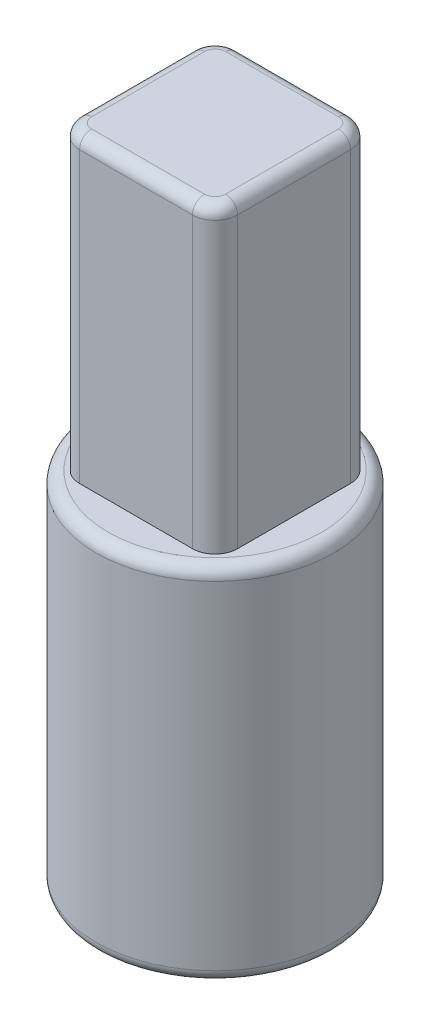
ISO-10303-21;
HEADER;
FILE_DESCRIPTION(('STEP AP214'),'2;1');
FILE_NAME('part.step','',(''),(''),'','','');
FILE_SCHEMA(('AUTOMOTIVE_DESIGN { 1 0 10303 214 1 1 1 1 }'));
ENDSEC;
DATA;
#1=APPLICATION_CONTEXT('core data for automotive mechanical design processes');
#2=APPLICATION_PROTOCOL_DEFINITION('international standard','automotive_design',2000,#1);
#3=PRODUCT_CONTEXT('',#1,'mechanical');
#4=PRODUCT('Part','Part','',(#3));
#5=PRODUCT_RELATED_PRODUCT_CATEGORY('part','',(#4));
#6=PRODUCT_DEFINITION_FORMATION('','',#4);
#7=PRODUCT_DEFINITION_CONTEXT('part definition',#1,'design');
#8=PRODUCT_DEFINITION('design','',#6,#7);
#9=PRODUCT_DEFINITION_SHAPE('','',#8);
#10=(LENGTH_UNIT() NAMED_UNIT(*) SI_UNIT(.MILLI.,.METRE.));
#11=(NAMED_UNIT(*) PLANE_ANGLE_UNIT() SI_UNIT($,.RADIAN.));
#12=(NAMED_UNIT(*) SI_UNIT($,.STERADIAN.) SOLID_ANGLE_UNIT());
#13=UNCERTAINTY_MEASURE_WITH_UNIT(LENGTH_MEASURE(1.E-05),#10,'distance_accuracy_value','');
#14=(GEOMETRIC_REPRESENTATION_CONTEXT(3) GLOBAL_UNCERTAINTY_ASSIGNED_CONTEXT((#13)) GLOBAL_UNIT_ASSIGNED_CONTEXT((#10,
#11,#12)) REPRESENTATION_CONTEXT('',''));
#15=CARTESIAN_POINT('',(0.,0.,0.));
#16=DIRECTION('',(0.,0.,1.));
#17=DIRECTION('',(1.,0.,0.));
#18=AXIS2_PLACEMENT_3D('',#15,#16,#17);
#19=CARTESIAN_POINT('',(0.,12.,0.));
#20=DIRECTION('',(0.,-1.,0.));
#21=DIRECTION('',(0.,0.,-1.));
#22=AXIS2_PLACEMENT_3D('',#19,#20,#21);
#23=CYLINDRICAL_SURFACE('',#22,3.95);
#24=CARTESIAN_POINT('',(0.,11.6,0.));
#25=DIRECTION('',(0.,1.,0.));
#26=DIRECTION('',(0.,0.,1.));
#27=AXIS2_PLACEMENT_3D('',#24,#25,#26);
#28=CIRCLE('',#27,3.95);
#29=CARTESIAN_POINT('',(0.,11.6,3.95));
#30=VERTEX_POINT('',#29);
#31=EDGE_CURVE('E247',#30,#30,#28,.F.);
#32=ORIENTED_EDGE('',*,*,#31,.T.);
#33=EDGE_LOOP('',(#32));
#34=FACE_BOUND('',#33,.T.);
#35=CARTESIAN_POINT('',(0.,0.399999999999999,0.));
#36=DIRECTION('',(0.,1.,0.));
#37=DIRECTION('',(0.,0.,1.));
#38=AXIS2_PLACEMENT_3D('',#35,#36,#37);
#39=CIRCLE('',#38,3.95);
#40=CARTESIAN_POINT('',(0.,0.399999999999999,3.95));
#41=VERTEX_POINT('',#40);
#42=EDGE_CURVE('E244',#41,#41,#39,.T.);
#43=ORIENTED_EDGE('',*,*,#42,.T.);
#44=EDGE_LOOP('',(#43));
#45=FACE_BOUND('',#44,.T.);
#46=ADVANCED_FACE('F35',(#34,#45),#23,.T.);
#47=CARTESIAN_POINT('',(0.,12.,0.));
#48=DIRECTION('',(0.,1.,0.));
#49=DIRECTION('',(0.,0.,1.));
#50=AXIS2_PLACEMENT_3D('',#47,#48,#49);
#51=PLANE('',#50);
#52=CARTESIAN_POINT('',(0.,12.,0.));
#53=DIRECTION('',(0.,1.,0.));
#54=DIRECTION('',(0.,0.,1.));
#55=AXIS2_PLACEMENT_3D('',#52,#53,#54);
#56=CIRCLE('',#55,3.55);
#57=CARTESIAN_POINT('',(0.,12.,3.55));
#58=VERTEX_POINT('',#57);
#59=EDGE_CURVE('E241',#58,#58,#56,.T.);
#60=ORIENTED_EDGE('',*,*,#59,.T.);
#61=EDGE_LOOP('',(#60));
#62=FACE_BOUND('',#61,.T.);
#63=DIRECTION('',(0.,0.,1.));
#64=VECTOR('',#63,1.);
#65=CARTESIAN_POINT('',(-2.625,12.,-2.625));
#66=LINE('',#65,#64);
#67=CARTESIAN_POINT('',(-2.625,12.,-1.875));
#68=VERTEX_POINT('',#67);
#69=CARTESIAN_POINT('',(-2.625,12.,1.875));
#70=VERTEX_POINT('',#69);
#71=EDGE_CURVE('E166',#68,#70,#66,.T.);
#72=ORIENTED_EDGE('',*,*,#71,.F.);
#73=CARTESIAN_POINT('',(-1.875,12.,-1.875));
#74=DIRECTION('',(0.,1.,0.));
#75=DIRECTION('',(0.,0.,1.));
#76=AXIS2_PLACEMENT_3D('',#73,#74,#75);
#77=CIRCLE('',#76,0.75);
#78=CARTESIAN_POINT('',(-1.875,12.,-2.625));
#79=VERTEX_POINT('',#78);
#80=EDGE_CURVE('E203',#68,#79,#77,.F.);
#81=ORIENTED_EDGE('',*,*,#80,.T.);
#82=DIRECTION('',(-1.,0.,0.));
#83=VECTOR('',#82,1.);
#84=CARTESIAN_POINT('',(-2.625,12.,-2.625));
#85=LINE('',#84,#83);
#86=CARTESIAN_POINT('',(1.875,12.,-2.625));
#87=VERTEX_POINT('',#86);
#88=EDGE_CURVE('E176',#87,#79,#85,.T.);
#89=ORIENTED_EDGE('',*,*,#88,.F.);
#90=CARTESIAN_POINT('',(1.875,12.,-1.875));
#91=DIRECTION('',(0.,1.,0.));
#92=DIRECTION('',(0.,0.,1.));
#93=AXIS2_PLACEMENT_3D('',#90,#91,#92);
#94=CIRCLE('',#93,0.75);
#95=CARTESIAN_POINT('',(2.625,12.,-1.875));
#96=VERTEX_POINT('',#95);
#97=EDGE_CURVE('E201',#87,#96,#94,.F.);
#98=ORIENTED_EDGE('',*,*,#97,.T.);
#99=DIRECTION('',(0.,0.,-1.));
#100=VECTOR('',#99,1.);
#101=CARTESIAN_POINT('',(2.625,12.,-2.625));
#102=LINE('',#101,#100);
#103=CARTESIAN_POINT('',(2.625,12.,1.875));
#104=VERTEX_POINT('',#103);
#105=EDGE_CURVE('E173',#104,#96,#102,.T.);
#106=ORIENTED_EDGE('',*,*,#105,.F.);
#107=CARTESIAN_POINT('',(1.875,12.,1.875));
#108=DIRECTION('',(0.,1.,0.));
#109=DIRECTION('',(0.,0.,1.));
#110=AXIS2_PLACEMENT_3D('',#107,#108,#109);
#111=CIRCLE('',#110,0.75);
#112=CARTESIAN_POINT('',(1.875,12.,2.625));
#113=VERTEX_POINT('',#112);
#114=EDGE_CURVE('E199',#104,#113,#111,.F.);
#115=ORIENTED_EDGE('',*,*,#114,.T.);
#116=DIRECTION('',(1.,0.,0.));
#117=VECTOR('',#116,1.);
#118=CARTESIAN_POINT('',(-2.625,12.,2.625));
#119=LINE('',#118,#117);
#120=CARTESIAN_POINT('',(-1.875,12.,2.625));
#121=VERTEX_POINT('',#120);
#122=EDGE_CURVE('E170',#121,#113,#119,.T.);
#123=ORIENTED_EDGE('',*,*,#122,.F.);
#124=CARTESIAN_POINT('',(-1.875,12.,1.875));
#125=DIRECTION('',(0.,1.,0.));
#126=DIRECTION('',(0.,0.,1.));
#127=AXIS2_PLACEMENT_3D('',#124,#125,#126);
#128=CIRCLE('',#127,0.75);
#129=EDGE_CURVE('E205',#121,#70,#128,.F.);
#130=ORIENTED_EDGE('',*,*,#129,.T.);
#131=EDGE_LOOP('',(#72,#81,#89,#98,#106,#115,#123,#130));
#132=FACE_BOUND('',#131,.T.);
#133=ADVANCED_FACE('F346',(#62,#132),#51,.T.);
#134=CARTESIAN_POINT('',(0.,0.,0.));
#135=DIRECTION('',(0.,1.,0.));
#136=DIRECTION('',(0.,0.,1.));
#137=AXIS2_PLACEMENT_3D('',#134,#135,#136);
#138=PLANE('',#137);
#139=CARTESIAN_POINT('',(0.,0.,0.));
#140=DIRECTION('',(0.,1.,0.));
#141=DIRECTION('',(0.,0.,1.));
#142=AXIS2_PLACEMENT_3D('',#139,#140,#141);
#143=CIRCLE('',#142,3.55);
#144=CARTESIAN_POINT('',(0.,0.,3.55));
#145=VERTEX_POINT('',#144);
#146=EDGE_CURVE('E255',#145,#145,#143,.F.);
#147=ORIENTED_EDGE('',*,*,#146,.T.);
#148=EDGE_LOOP('',(#147));
#149=FACE_BOUND('',#148,.T.);
#150=CARTESIAN_POINT('',(0.,0.,0.));
#151=DIRECTION('',(0.,1.,0.));
#152=DIRECTION('',(0.,0.,1.));
#153=AXIS2_PLACEMENT_3D('',#150,#151,#152);
#154=CIRCLE('',#153,2.25);
#155=CARTESIAN_POINT('',(-1.13954094858372,0.,-1.94008928312614));
#156=VERTEX_POINT('',#155);
#157=CARTESIAN_POINT('',(1.13954094858372,0.,-1.94008928312614));
#158=VERTEX_POINT('',#157);
#159=EDGE_CURVE('E250',#156,#158,#154,.T.);
#160=ORIENTED_EDGE('',*,*,#159,.T.);
#161=DIRECTION('',(1.,0.,0.));
#162=VECTOR('',#161,1.);
#163=CARTESIAN_POINT('',(0.,0.,-1.94008928312614));
#164=LINE('',#163,#162);
#165=EDGE_CURVE('E252',#158,#156,#164,.F.);
#166=ORIENTED_EDGE('',*,*,#165,.T.);
#167=EDGE_LOOP('',(#160,#166));
#168=FACE_BOUND('',#167,.T.);
#169=ADVANCED_FACE('F348',(#149,#168),#138,.F.);
#170=CARTESIAN_POINT('',(-2.625,22.,-2.625));
#171=DIRECTION('',(1.,0.,0.));
#172=DIRECTION('',(0.,0.,-1.));
#173=AXIS2_PLACEMENT_3D('',#170,#171,#172);
#174=PLANE('',#173);
#175=DIRECTION('',(0.,-1.,0.));
#176=VECTOR('',#175,1.);
#177=CARTESIAN_POINT('',(-2.625,22.,1.875));
#178=LINE('',#177,#176);
#179=CARTESIAN_POINT('',(-2.625,21.6,1.875));
#180=VERTEX_POINT('',#179);
#181=EDGE_CURVE('E194',#70,#180,#178,.F.);
#182=ORIENTED_EDGE('',*,*,#181,.T.);
#183=DIRECTION('',(0.,0.,1.));
#184=VECTOR('',#183,1.);
#185=CARTESIAN_POINT('',(-2.625,21.6,-1.875));
#186=LINE('',#185,#184);
#187=CARTESIAN_POINT('',(-2.625,21.6,-1.875));
#188=VERTEX_POINT('',#187);
#189=EDGE_CURVE('E239',#180,#188,#186,.F.);
#190=ORIENTED_EDGE('',*,*,#189,.T.);
#191=DIRECTION('',(0.,-1.,0.));
#192=VECTOR('',#191,1.);
#193=CARTESIAN_POINT('',(-2.625,22.,-1.875));
#194=LINE('',#193,#192);
#195=EDGE_CURVE('E197',#188,#68,#194,.T.);
#196=ORIENTED_EDGE('',*,*,#195,.T.);
#197=ORIENTED_EDGE('',*,*,#71,.T.);
#198=EDGE_LOOP('',(#182,#190,#196,#197));
#199=FACE_BOUND('',#198,.T.);
#200=ADVANCED_FACE('F351',(#199),#174,.F.);
#201=CARTESIAN_POINT('',(-2.625,22.,2.625));
#202=DIRECTION('',(0.,0.,-1.));
#203=DIRECTION('',(-1.,0.,0.));
#204=AXIS2_PLACEMENT_3D('',#201,#202,#203);
#205=PLANE('',#204);
#206=DIRECTION('',(0.,-1.,0.));
#207=VECTOR('',#206,1.);
#208=CARTESIAN_POINT('',(1.875,22.,2.625));
#209=LINE('',#208,#207);
#210=CARTESIAN_POINT('',(1.875,21.6,2.625));
#211=VERTEX_POINT('',#210);
#212=EDGE_CURVE('E186',#113,#211,#209,.F.);
#213=ORIENTED_EDGE('',*,*,#212,.T.);
#214=DIRECTION('',(1.,0.,0.));
#215=VECTOR('',#214,1.);
#216=CARTESIAN_POINT('',(-1.875,21.6,2.625));
#217=LINE('',#216,#215);
#218=CARTESIAN_POINT('',(-1.875,21.6,2.625));
#219=VERTEX_POINT('',#218);
#220=EDGE_CURVE('E235',#211,#219,#217,.F.);
#221=ORIENTED_EDGE('',*,*,#220,.T.);
#222=DIRECTION('',(0.,-1.,0.));
#223=VECTOR('',#222,1.);
#224=CARTESIAN_POINT('',(-1.875,22.,2.625));
#225=LINE('',#224,#223);
#226=EDGE_CURVE('E184',#219,#121,#225,.T.);
#227=ORIENTED_EDGE('',*,*,#226,.T.);
#228=ORIENTED_EDGE('',*,*,#122,.T.);
#229=EDGE_LOOP('',(#213,#221,#227,#228));
#230=FACE_BOUND('',#229,.T.);
#231=ADVANCED_FACE('F358',(#230),#205,.F.);
#232=CARTESIAN_POINT('',(2.625,22.,-2.625));
#233=DIRECTION('',(-1.,0.,0.));
#234=DIRECTION('',(0.,0.,1.));
#235=AXIS2_PLACEMENT_3D('',#232,#233,#234);
#236=PLANE('',#235);
#237=DIRECTION('',(0.,-1.,0.));
#238=VECTOR('',#237,1.);
#239=CARTESIAN_POINT('',(2.625,22.,-1.875));
#240=LINE('',#239,#238);
#241=CARTESIAN_POINT('',(2.625,21.6,-1.875));
#242=VERTEX_POINT('',#241);
#243=EDGE_CURVE('E179',#96,#242,#240,.F.);
#244=ORIENTED_EDGE('',*,*,#243,.T.);
#245=DIRECTION('',(0.,0.,-1.));
#246=VECTOR('',#245,1.);
#247=CARTESIAN_POINT('',(2.625,21.6,1.875));
#248=LINE('',#247,#246);
#249=CARTESIAN_POINT('',(2.625,21.6,1.875));
#250=VERTEX_POINT('',#249);
#251=EDGE_CURVE('E231',#242,#250,#248,.F.);
#252=ORIENTED_EDGE('',*,*,#251,.T.);
#253=DIRECTION('',(0.,-1.,0.));
#254=VECTOR('',#253,1.);
#255=CARTESIAN_POINT('',(2.625,22.,1.875));
#256=LINE('',#255,#254);
#257=EDGE_CURVE('E182',#250,#104,#256,.T.);
#258=ORIENTED_EDGE('',*,*,#257,.T.);
#259=ORIENTED_EDGE('',*,*,#105,.T.);
#260=EDGE_LOOP('',(#244,#252,#258,#259));
#261=FACE_BOUND('',#260,.T.);
#262=ADVANCED_FACE('F362',(#261),#236,.F.);
#263=CARTESIAN_POINT('',(-2.625,22.,-2.625));
#264=DIRECTION('',(0.,0.,1.));
#265=DIRECTION('',(1.,0.,0.));
#266=AXIS2_PLACEMENT_3D('',#263,#264,#265);
#267=PLANE('',#266);
#268=DIRECTION('',(0.,-1.,0.));
#269=VECTOR('',#268,1.);
#270=CARTESIAN_POINT('',(-1.875,22.,-2.625));
#271=LINE('',#270,#269);
#272=CARTESIAN_POINT('',(-1.875,21.6,-2.625));
#273=VERTEX_POINT('',#272);
#274=EDGE_CURVE('E189',#79,#273,#271,.F.);
#275=ORIENTED_EDGE('',*,*,#274,.T.);
#276=DIRECTION('',(-1.,0.,0.));
#277=VECTOR('',#276,1.);
#278=CARTESIAN_POINT('',(1.875,21.6,-2.625));
#279=LINE('',#278,#277);
#280=CARTESIAN_POINT('',(1.875,21.6,-2.625));
#281=VERTEX_POINT('',#280);
#282=EDGE_CURVE('E227',#273,#281,#279,.F.);
#283=ORIENTED_EDGE('',*,*,#282,.T.);
#284=DIRECTION('',(0.,-1.,0.));
#285=VECTOR('',#284,1.);
#286=CARTESIAN_POINT('',(1.875,22.,-2.625));
#287=LINE('',#286,#285);
#288=EDGE_CURVE('E192',#281,#87,#287,.T.);
#289=ORIENTED_EDGE('',*,*,#288,.T.);
#290=ORIENTED_EDGE('',*,*,#88,.T.);
#291=EDGE_LOOP('',(#275,#283,#289,#290));
#292=FACE_BOUND('',#291,.T.);
#293=ADVANCED_FACE('F366',(#292),#267,.F.);
#294=CARTESIAN_POINT('',(0.,22.,0.));
#295=DIRECTION('',(0.,1.,0.));
#296=DIRECTION('',(0.,0.,1.));
#297=AXIS2_PLACEMENT_3D('',#294,#295,#296);
#298=PLANE('',#297);
#299=DIRECTION('',(-1.,0.,0.));
#300=VECTOR('',#299,1.);
#301=CARTESIAN_POINT('',(-1.875,22.,-2.225));
#302=LINE('',#301,#300);
#303=CARTESIAN_POINT('',(1.875,22.,-2.225));
#304=VERTEX_POINT('',#303);
#305=CARTESIAN_POINT('',(-1.875,22.,-2.225));
#306=VERTEX_POINT('',#305);
#307=EDGE_CURVE('E219',#304,#306,#302,.T.);
#308=ORIENTED_EDGE('',*,*,#307,.T.);
#309=CARTESIAN_POINT('',(-1.875,22.,-1.875));
#310=DIRECTION('',(0.,1.,0.));
#311=DIRECTION('',(0.,0.,1.));
#312=AXIS2_PLACEMENT_3D('',#309,#310,#311);
#313=CIRCLE('',#312,0.35);
#314=CARTESIAN_POINT('',(-2.225,22.,-1.875));
#315=VERTEX_POINT('',#314);
#316=EDGE_CURVE('E221',#306,#315,#313,.T.);
#317=ORIENTED_EDGE('',*,*,#316,.T.);
#318=DIRECTION('',(0.,0.,1.));
#319=VECTOR('',#318,1.);
#320=CARTESIAN_POINT('',(-2.225,22.,1.875));
#321=LINE('',#320,#319);
#322=CARTESIAN_POINT('',(-2.225,22.,1.875));
#323=VERTEX_POINT('',#322);
#324=EDGE_CURVE('E207',#315,#323,#321,.T.);
#325=ORIENTED_EDGE('',*,*,#324,.T.);
#326=CARTESIAN_POINT('',(-1.875,22.,1.875));
#327=DIRECTION('',(0.,1.,0.));
#328=DIRECTION('',(0.,0.,1.));
#329=AXIS2_PLACEMENT_3D('',#326,#327,#328);
#330=CIRCLE('',#329,0.35);
#331=CARTESIAN_POINT('',(-1.875,22.,2.225));
#332=VERTEX_POINT('',#331);
#333=EDGE_CURVE('E209',#323,#332,#330,.T.);
#334=ORIENTED_EDGE('',*,*,#333,.T.);
#335=DIRECTION('',(1.,0.,0.));
#336=VECTOR('',#335,1.);
#337=CARTESIAN_POINT('',(1.875,22.,2.225));
#338=LINE('',#337,#336);
#339=CARTESIAN_POINT('',(1.875,22.,2.225));
#340=VERTEX_POINT('',#339);
#341=EDGE_CURVE('E211',#332,#340,#338,.T.);
#342=ORIENTED_EDGE('',*,*,#341,.T.);
#343=CARTESIAN_POINT('',(1.875,22.,1.875));
#344=DIRECTION('',(0.,1.,0.));
#345=DIRECTION('',(0.,0.,1.));
#346=AXIS2_PLACEMENT_3D('',#343,#344,#345);
#347=CIRCLE('',#346,0.35);
#348=CARTESIAN_POINT('',(2.225,22.,1.875));
#349=VERTEX_POINT('',#348);
#350=EDGE_CURVE('E213',#340,#349,#347,.T.);
#351=ORIENTED_EDGE('',*,*,#350,.T.);
#352=DIRECTION('',(0.,0.,-1.));
#353=VECTOR('',#352,1.);
#354=CARTESIAN_POINT('',(2.225,22.,-1.875));
#355=LINE('',#354,#353);
#356=CARTESIAN_POINT('',(2.225,22.,-1.875));
#357=VERTEX_POINT('',#356);
#358=EDGE_CURVE('E215',#349,#357,#355,.T.);
#359=ORIENTED_EDGE('',*,*,#358,.T.);
#360=CARTESIAN_POINT('',(1.875,22.,-1.875));
#361=DIRECTION('',(0.,1.,0.));
#362=DIRECTION('',(0.,0.,1.));
#363=AXIS2_PLACEMENT_3D('',#360,#361,#362);
#364=CIRCLE('',#363,0.35);
#365=EDGE_CURVE('E217',#357,#304,#364,.T.);
#366=ORIENTED_EDGE('',*,*,#365,.T.);
#367=EDGE_LOOP('',(#308,#317,#325,#334,#342,#351,#359,#366));
#368=FACE_BOUND('',#367,.T.);
#369=ADVANCED_FACE('F370',(#368),#298,.T.);
#370=CARTESIAN_POINT('',(0.,11.,0.));
#371=DIRECTION('',(0.,-1.,0.));
#372=DIRECTION('',(0.,0.,-1.));
#373=AXIS2_PLACEMENT_3D('',#370,#371,#372);
#374=CYLINDRICAL_SURFACE('',#373,1.85);
#375=DIRECTION('',(0.,-1.,0.));
#376=VECTOR('',#375,1.);
#377=CARTESIAN_POINT('',(1.025,11.,-1.54008928312614));
#378=LINE('',#377,#376);
#379=CARTESIAN_POINT('',(1.025,11.,-1.54008928312614));
#380=VERTEX_POINT('',#379);
#381=CARTESIAN_POINT('',(1.025,0.399999999999999,-1.54008928312614));
#382=VERTEX_POINT('',#381);
#383=EDGE_CURVE('E156',#380,#382,#378,.T.);
#384=ORIENTED_EDGE('',*,*,#383,.T.);
#385=CARTESIAN_POINT('',(0.,0.399999999999999,0.));
#386=DIRECTION('',(0.,1.,0.));
#387=DIRECTION('',(0.,0.,1.));
#388=AXIS2_PLACEMENT_3D('',#385,#386,#387);
#389=CIRCLE('',#388,1.85);
#390=CARTESIAN_POINT('',(-1.025,0.399999999999999,-1.54008928312614));
#391=VERTEX_POINT('',#390);
#392=EDGE_CURVE('E11',#382,#391,#389,.F.);
#393=ORIENTED_EDGE('',*,*,#392,.T.);
#394=DIRECTION('',(0.,-1.,0.));
#395=VECTOR('',#394,1.);
#396=CARTESIAN_POINT('',(-1.025,11.,-1.54008928312614));
#397=LINE('',#396,#395);
#398=CARTESIAN_POINT('',(-1.025,11.,-1.54008928312614));
#399=VERTEX_POINT('',#398);
#400=EDGE_CURVE('E147',#399,#391,#397,.T.);
#401=ORIENTED_EDGE('',*,*,#400,.F.);
#402=CARTESIAN_POINT('',(0.,11.,0.));
#403=DIRECTION('',(0.,-1.,0.));
#404=DIRECTION('',(0.,0.,-1.));
#405=AXIS2_PLACEMENT_3D('',#402,#403,#404);
#406=CIRCLE('',#405,1.85);
#407=EDGE_CURVE('E150',#380,#399,#406,.T.);
#408=ORIENTED_EDGE('',*,*,#407,.F.);
#409=EDGE_LOOP('',(#384,#393,#401,#408));
#410=FACE_BOUND('',#409,.T.);
#411=ADVANCED_FACE('F149',(#410),#374,.F.);
#412=CARTESIAN_POINT('',(1.025,11.,-1.54008928312614));
#413=DIRECTION('',(0.,0.,-1.));
#414=DIRECTION('',(-1.,0.,0.));
#415=AXIS2_PLACEMENT_3D('',#412,#413,#414);
#416=PLANE('',#415);
#417=ORIENTED_EDGE('',*,*,#400,.T.);
#418=DIRECTION('',(1.,0.,0.));
#419=VECTOR('',#418,1.);
#420=CARTESIAN_POINT('',(1.025,0.399999999999999,-1.54008928312614));
#421=LINE('',#420,#419);
#422=EDGE_CURVE('E49',#391,#382,#421,.T.);
#423=ORIENTED_EDGE('',*,*,#422,.T.);
#424=ORIENTED_EDGE('',*,*,#383,.F.);
#425=DIRECTION('',(1.,0.,0.));
#426=VECTOR('',#425,1.);
#427=CARTESIAN_POINT('',(1.025,11.,-1.54008928312614));
#428=LINE('',#427,#426);
#429=EDGE_CURVE('E157',#399,#380,#428,.T.);
#430=ORIENTED_EDGE('',*,*,#429,.F.);
#431=EDGE_LOOP('',(#417,#423,#424,#430));
#432=FACE_BOUND('',#431,.T.);
#433=ADVANCED_FACE('F163',(#432),#416,.F.);
#434=CARTESIAN_POINT('',(0.,11.,0.));
#435=DIRECTION('',(0.,-1.,0.));
#436=DIRECTION('',(0.,0.,-1.));
#437=AXIS2_PLACEMENT_3D('',#434,#435,#436);
#438=PLANE('',#437);
#439=ORIENTED_EDGE('',*,*,#407,.T.);
#440=ORIENTED_EDGE('',*,*,#429,.T.);
#441=EDGE_LOOP('',(#439,#440));
#442=FACE_BOUND('',#441,.T.);
#443=ADVANCED_FACE('F160',(#442),#438,.T.);
#444=CARTESIAN_POINT('',(1.875,22.,1.875));
#445=DIRECTION('',(0.,-1.,0.));
#446=DIRECTION('',(0.,0.,-1.));
#447=AXIS2_PLACEMENT_3D('',#444,#445,#446);
#448=CYLINDRICAL_SURFACE('',#447,0.75);
#449=ORIENTED_EDGE('',*,*,#257,.F.);
#450=CARTESIAN_POINT('',(1.875,21.6,1.875));
#451=DIRECTION('',(0.,1.,0.));
#452=DIRECTION('',(0.,0.,1.));
#453=AXIS2_PLACEMENT_3D('',#450,#451,#452);
#454=CIRCLE('',#453,0.75);
#455=EDGE_CURVE('E233',#250,#211,#454,.F.);
#456=ORIENTED_EDGE('',*,*,#455,.T.);
#457=ORIENTED_EDGE('',*,*,#212,.F.);
#458=ORIENTED_EDGE('',*,*,#114,.F.);
#459=EDGE_LOOP('',(#449,#456,#457,#458));
#460=FACE_BOUND('',#459,.T.);
#461=ADVANCED_FACE('F339',(#460),#448,.T.);
#462=CARTESIAN_POINT('',(1.875,22.,-1.875));
#463=DIRECTION('',(0.,-1.,0.));
#464=DIRECTION('',(0.,0.,-1.));
#465=AXIS2_PLACEMENT_3D('',#462,#463,#464);
#466=CYLINDRICAL_SURFACE('',#465,0.75);
#467=ORIENTED_EDGE('',*,*,#288,.F.);
#468=CARTESIAN_POINT('',(1.875,21.6,-1.875));
#469=DIRECTION('',(0.,1.,0.));
#470=DIRECTION('',(0.,0.,1.));
#471=AXIS2_PLACEMENT_3D('',#468,#469,#470);
#472=CIRCLE('',#471,0.75);
#473=EDGE_CURVE('E229',#281,#242,#472,.F.);
#474=ORIENTED_EDGE('',*,*,#473,.T.);
#475=ORIENTED_EDGE('',*,*,#243,.F.);
#476=ORIENTED_EDGE('',*,*,#97,.F.);
#477=EDGE_LOOP('',(#467,#474,#475,#476));
#478=FACE_BOUND('',#477,.T.);
#479=ADVANCED_FACE('F335',(#478),#466,.T.);
#480=CARTESIAN_POINT('',(-1.875,22.,-1.875));
#481=DIRECTION('',(0.,-1.,0.));
#482=DIRECTION('',(0.,0.,-1.));
#483=AXIS2_PLACEMENT_3D('',#480,#481,#482);
#484=CYLINDRICAL_SURFACE('',#483,0.75);
#485=ORIENTED_EDGE('',*,*,#195,.F.);
#486=CARTESIAN_POINT('',(-1.875,21.6,-1.875));
#487=DIRECTION('',(0.,1.,0.));
#488=DIRECTION('',(0.,0.,1.));
#489=AXIS2_PLACEMENT_3D('',#486,#487,#488);
#490=CIRCLE('',#489,0.75);
#491=EDGE_CURVE('E224',#188,#273,#490,.F.);
#492=ORIENTED_EDGE('',*,*,#491,.T.);
#493=ORIENTED_EDGE('',*,*,#274,.F.);
#494=ORIENTED_EDGE('',*,*,#80,.F.);
#495=EDGE_LOOP('',(#485,#492,#493,#494));
#496=FACE_BOUND('',#495,.T.);
#497=ADVANCED_FACE('F331',(#496),#484,.T.);
#498=CARTESIAN_POINT('',(-1.875,22.,1.875));
#499=DIRECTION('',(0.,-1.,0.));
#500=DIRECTION('',(0.,0.,-1.));
#501=AXIS2_PLACEMENT_3D('',#498,#499,#500);
#502=CYLINDRICAL_SURFACE('',#501,0.75);
#503=ORIENTED_EDGE('',*,*,#226,.F.);
#504=CARTESIAN_POINT('',(-1.875,21.6,1.875));
#505=DIRECTION('',(0.,1.,0.));
#506=DIRECTION('',(0.,0.,1.));
#507=AXIS2_PLACEMENT_3D('',#504,#505,#506);
#508=CIRCLE('',#507,0.75);
#509=EDGE_CURVE('E237',#219,#180,#508,.F.);
#510=ORIENTED_EDGE('',*,*,#509,.T.);
#511=ORIENTED_EDGE('',*,*,#181,.F.);
#512=ORIENTED_EDGE('',*,*,#129,.F.);
#513=EDGE_LOOP('',(#503,#510,#511,#512));
#514=FACE_BOUND('',#513,.T.);
#515=ADVANCED_FACE('F301',(#514),#502,.T.);
#516=CARTESIAN_POINT('',(1.875,21.6,1.875));
#517=DIRECTION('',(0.,1.,0.));
#518=DIRECTION('',(0.,0.,1.));
#519=AXIS2_PLACEMENT_3D('',#516,#517,#518);
#520=DEGENERATE_TOROIDAL_SURFACE('',#519,0.35,0.4,.T.);
#521=CARTESIAN_POINT('',(1.875,21.6,2.225));
#522=DIRECTION('',(-1.,0.,0.));
#523=DIRECTION('',(0.,0.,1.));
#524=AXIS2_PLACEMENT_3D('',#521,#522,#523);
#525=CIRCLE('',#524,0.4);
#526=EDGE_CURVE('E275',#211,#340,#525,.T.);
#527=ORIENTED_EDGE('',*,*,#526,.F.);
#528=ORIENTED_EDGE('',*,*,#455,.F.);
#529=CARTESIAN_POINT('',(2.225,21.6,1.875));
#530=DIRECTION('',(0.,0.,-1.));
#531=DIRECTION('',(-1.,0.,0.));
#532=AXIS2_PLACEMENT_3D('',#529,#530,#531);
#533=CIRCLE('',#532,0.4);
#534=EDGE_CURVE('E161',#349,#250,#533,.T.);
#535=ORIENTED_EDGE('',*,*,#534,.F.);
#536=ORIENTED_EDGE('',*,*,#350,.F.);
#537=EDGE_LOOP('',(#527,#528,#535,#536));
#538=FACE_BOUND('',#537,.T.);
#539=ADVANCED_FACE('F297',(#538),#520,.T.);
#540=CARTESIAN_POINT('',(2.225,21.6,0.));
#541=DIRECTION('',(0.,0.,1.));
#542=DIRECTION('',(1.,0.,0.));
#543=AXIS2_PLACEMENT_3D('',#540,#541,#542);
#544=CYLINDRICAL_SURFACE('',#543,0.4);
#545=ORIENTED_EDGE('',*,*,#534,.T.);
#546=ORIENTED_EDGE('',*,*,#251,.F.);
#547=CARTESIAN_POINT('',(2.225,21.6,-1.875));
#548=DIRECTION('',(0.,0.,-1.));
#549=DIRECTION('',(-1.,0.,0.));
#550=AXIS2_PLACEMENT_3D('',#547,#548,#549);
#551=CIRCLE('',#550,0.4);
#552=EDGE_CURVE('E272',#357,#242,#551,.T.);
#553=ORIENTED_EDGE('',*,*,#552,.F.);
#554=ORIENTED_EDGE('',*,*,#358,.F.);
#555=EDGE_LOOP('',(#545,#546,#553,#554));
#556=FACE_BOUND('',#555,.T.);
#557=ADVANCED_FACE('F300',(#556),#544,.T.);
#558=CARTESIAN_POINT('',(0.,21.6,2.225));
#559=DIRECTION('',(-1.,0.,0.));
#560=DIRECTION('',(0.,0.,1.));
#561=AXIS2_PLACEMENT_3D('',#558,#559,#560);
#562=CYLINDRICAL_SURFACE('',#561,0.4);
#563=ORIENTED_EDGE('',*,*,#526,.T.);
#564=ORIENTED_EDGE('',*,*,#341,.F.);
#565=CARTESIAN_POINT('',(-1.875,21.6,2.225));
#566=DIRECTION('',(-1.,0.,0.));
#567=DIRECTION('',(0.,0.,1.));
#568=AXIS2_PLACEMENT_3D('',#565,#566,#567);
#569=CIRCLE('',#568,0.4);
#570=EDGE_CURVE('E269',#219,#332,#569,.T.);
#571=ORIENTED_EDGE('',*,*,#570,.F.);
#572=ORIENTED_EDGE('',*,*,#220,.F.);
#573=EDGE_LOOP('',(#563,#564,#571,#572));
#574=FACE_BOUND('',#573,.T.);
#575=ADVANCED_FACE('F305',(#574),#562,.T.);
#576=CARTESIAN_POINT('',(1.875,21.6,-1.875));
#577=DIRECTION('',(0.,1.,0.));
#578=DIRECTION('',(0.,0.,1.));
#579=AXIS2_PLACEMENT_3D('',#576,#577,#578);
#580=DEGENERATE_TOROIDAL_SURFACE('',#579,0.35,0.4,.T.);
#581=ORIENTED_EDGE('',*,*,#552,.T.);
#582=ORIENTED_EDGE('',*,*,#473,.F.);
#583=CARTESIAN_POINT('',(1.875,21.6,-2.225));
#584=DIRECTION('',(-1.,0.,0.));
#585=DIRECTION('',(0.,0.,1.));
#586=AXIS2_PLACEMENT_3D('',#583,#584,#585);
#587=CIRCLE('',#586,0.4);
#588=EDGE_CURVE('E266',#304,#281,#587,.T.);
#589=ORIENTED_EDGE('',*,*,#588,.F.);
#590=ORIENTED_EDGE('',*,*,#365,.F.);
#591=EDGE_LOOP('',(#581,#582,#589,#590));
#592=FACE_BOUND('',#591,.T.);
#593=ADVANCED_FACE('F309',(#592),#580,.T.);
#594=CARTESIAN_POINT('',(-1.875,21.6,1.875));
#595=DIRECTION('',(0.,1.,0.));
#596=DIRECTION('',(0.,0.,1.));
#597=AXIS2_PLACEMENT_3D('',#594,#595,#596);
#598=DEGENERATE_TOROIDAL_SURFACE('',#597,0.35,0.4,.T.);
#599=ORIENTED_EDGE('',*,*,#570,.T.);
#600=ORIENTED_EDGE('',*,*,#333,.F.);
#601=CARTESIAN_POINT('',(-2.225,21.6,1.875));
#602=DIRECTION('',(0.,0.,-1.));
#603=DIRECTION('',(-1.,0.,0.));
#604=AXIS2_PLACEMENT_3D('',#601,#602,#603);
#605=CIRCLE('',#604,0.4);
#606=EDGE_CURVE('E263',#180,#323,#605,.T.);
#607=ORIENTED_EDGE('',*,*,#606,.F.);
#608=ORIENTED_EDGE('',*,*,#509,.F.);
#609=EDGE_LOOP('',(#599,#600,#607,#608));
#610=FACE_BOUND('',#609,.T.);
#611=ADVANCED_FACE('F313',(#610),#598,.T.);
#612=CARTESIAN_POINT('',(0.,21.6,-2.225));
#613=DIRECTION('',(1.,0.,0.));
#614=DIRECTION('',(0.,0.,-1.));
#615=AXIS2_PLACEMENT_3D('',#612,#613,#614);
#616=CYLINDRICAL_SURFACE('',#615,0.4);
#617=ORIENTED_EDGE('',*,*,#588,.T.);
#618=ORIENTED_EDGE('',*,*,#282,.F.);
#619=CARTESIAN_POINT('',(-1.875,21.6,-2.225));
#620=DIRECTION('',(-1.,0.,0.));
#621=DIRECTION('',(0.,0.,1.));
#622=AXIS2_PLACEMENT_3D('',#619,#620,#621);
#623=CIRCLE('',#622,0.4);
#624=EDGE_CURVE('E261',#306,#273,#623,.T.);
#625=ORIENTED_EDGE('',*,*,#624,.F.);
#626=ORIENTED_EDGE('',*,*,#307,.F.);
#627=EDGE_LOOP('',(#617,#618,#625,#626));
#628=FACE_BOUND('',#627,.T.);
#629=ADVANCED_FACE('F317',(#628),#616,.T.);
#630=CARTESIAN_POINT('',(-2.225,21.6,0.));
#631=DIRECTION('',(0.,0.,-1.));
#632=DIRECTION('',(-1.,0.,0.));
#633=AXIS2_PLACEMENT_3D('',#630,#631,#632);
#634=CYLINDRICAL_SURFACE('',#633,0.4);
#635=ORIENTED_EDGE('',*,*,#606,.T.);
#636=ORIENTED_EDGE('',*,*,#324,.F.);
#637=CARTESIAN_POINT('',(-2.225,21.6,-1.875));
#638=DIRECTION('',(0.,0.,-1.));
#639=DIRECTION('',(-1.,0.,0.));
#640=AXIS2_PLACEMENT_3D('',#637,#638,#639);
#641=CIRCLE('',#640,0.4);
#642=EDGE_CURVE('E259',#188,#315,#641,.T.);
#643=ORIENTED_EDGE('',*,*,#642,.F.);
#644=ORIENTED_EDGE('',*,*,#189,.F.);
#645=EDGE_LOOP('',(#635,#636,#643,#644));
#646=FACE_BOUND('',#645,.T.);
#647=ADVANCED_FACE('F321',(#646),#634,.T.);
#648=CARTESIAN_POINT('',(-1.875,21.6,-1.875));
#649=DIRECTION('',(0.,1.,0.));
#650=DIRECTION('',(0.,0.,1.));
#651=AXIS2_PLACEMENT_3D('',#648,#649,#650);
#652=DEGENERATE_TOROIDAL_SURFACE('',#651,0.35,0.4,.T.);
#653=ORIENTED_EDGE('',*,*,#624,.T.);
#654=ORIENTED_EDGE('',*,*,#491,.F.);
#655=ORIENTED_EDGE('',*,*,#642,.T.);
#656=ORIENTED_EDGE('',*,*,#316,.F.);
#657=EDGE_LOOP('',(#653,#654,#655,#656));
#658=FACE_BOUND('',#657,.T.);
#659=ADVANCED_FACE('F295',(#658),#652,.T.);
#660=CARTESIAN_POINT('',(0.,11.6,0.));
#661=DIRECTION('',(0.,1.,0.));
#662=DIRECTION('',(0.,0.,1.));
#663=AXIS2_PLACEMENT_3D('',#660,#661,#662);
#664=TOROIDAL_SURFACE('',#663,3.55,0.4);
#665=ORIENTED_EDGE('',*,*,#31,.F.);
#666=EDGE_LOOP('',(#665));
#667=FACE_BOUND('',#666,.T.);
#668=ORIENTED_EDGE('',*,*,#59,.F.);
#669=EDGE_LOOP('',(#668));
#670=FACE_BOUND('',#669,.T.);
#671=ADVANCED_FACE('F291',(#667,#670),#664,.T.);
#672=CARTESIAN_POINT('',(0.,0.399999999999999,0.));
#673=DIRECTION('',(0.,1.,0.));
#674=DIRECTION('',(0.,0.,1.));
#675=AXIS2_PLACEMENT_3D('',#672,#673,#674);
#676=TOROIDAL_SURFACE('',#675,3.55,0.4);
#677=ORIENTED_EDGE('',*,*,#146,.F.);
#678=EDGE_LOOP('',(#677));
#679=FACE_BOUND('',#678,.T.);
#680=ORIENTED_EDGE('',*,*,#42,.F.);
#681=EDGE_LOOP('',(#680));
#682=FACE_BOUND('',#681,.T.);
#683=ADVANCED_FACE('F287',(#679,#682),#676,.T.);
#684=CARTESIAN_POINT('',(0.,0.399999999999999,0.));
#685=DIRECTION('',(0.,1.,0.));
#686=DIRECTION('',(0.,0.,1.));
#687=AXIS2_PLACEMENT_3D('',#684,#685,#686);
#688=TOROIDAL_SURFACE('',#687,2.25,0.4);
#689=CARTESIAN_POINT('',(1.025,0.399999999999999,-1.54008928312614));
#690=CARTESIAN_POINT('',(1.02499172858469,0.378169470857796,-1.54006731748636));
#691=CARTESIAN_POINT('',(1.02553989580814,0.356350880643575,-1.54187495555511));
#692=CARTESIAN_POINT('',(1.027685662777,0.3133854653787,-1.54898022858976));
#693=CARTESIAN_POINT('',(1.02928117312,0.292237390552781,-1.55427091509154));
#694=CARTESIAN_POINT('',(1.03345867249672,0.251168929812833,-1.5681743975583));
#695=CARTESIAN_POINT('',(1.03604067694633,0.231248563089782,-1.57678724543855));
#696=CARTESIAN_POINT('',(1.04208171194526,0.193158837833812,-1.59704140788851));
#697=CARTESIAN_POINT('',(1.04554086880824,0.174989732010377,-1.60868315863934));
#698=CARTESIAN_POINT('',(1.05327957696237,0.140520896315728,-1.6348870311341));
#699=CARTESIAN_POINT('',(1.05757370395639,0.124264127765933,-1.64950128965701));
#700=CARTESIAN_POINT('',(1.06678500071126,0.0944150248371041,-1.681071897698));
#701=CARTESIAN_POINT('',(1.07170239687526,0.080823663262717,-1.69802909849488));
#702=CARTESIAN_POINT('',(1.08220670835368,0.0561255154321324,-1.73452869331143));
#703=CARTESIAN_POINT('',(1.08781249311958,0.0451392978207061,-1.75414717019477));
#704=CARTESIAN_POINT('',(1.09935028591535,0.0266258265854359,-1.79486079619171));
#705=CARTESIAN_POINT('',(1.10528219955049,0.0190975779274872,-1.8159555184983));
#706=CARTESIAN_POINT('',(1.11571445909767,0.00916914226072925,-1.85336347957788));
#707=CARTESIAN_POINT('',(1.12018043811266,0.00594060712037156,-1.86947303627937));
#708=CARTESIAN_POINT('',(1.12912761847888,0.00148727467398718,-1.90194230118843));
#709=CARTESIAN_POINT('',(1.13360877843189,0.000258911191903312,-1.91830151157919));
#710=CARTESIAN_POINT('',(1.13855732795438,1.22278773933658E-05,-1.93647367504493));
#711=CARTESIAN_POINT('',(1.13904931479844,-3.27026729561598E-08,-1.93828153792101));
#712=CARTESIAN_POINT('',(1.13954094858372,0.,-1.94008928312614));
#713=B_SPLINE_CURVE_WITH_KNOTS('',3,(#689,#690,#691,#692,#693,#694,#695,#696,#697,#698,#699,
#700,#701,#702,#703,#704,#705,#706,#707,#708,#709,#710,#711,#712),.UNSPECIFIED.,.F.,.F.,(4,2,2,
2,2,2,2,2,2,2,2,4),(0.,0.0653917490075262,0.130653439266199,0.195916149407543,0.261188262997548,
0.327723036110769,0.394282047686959,0.463492968176658,0.532683960657741,0.583654611770766,
0.634534285622334,0.640155052595028),.UNSPECIFIED.);
#714=EDGE_CURVE('E63',#158,#382,#713,.F.);
#715=ORIENTED_EDGE('',*,*,#714,.F.);
#716=ORIENTED_EDGE('',*,*,#159,.F.);
#717=CARTESIAN_POINT('',(-1.025,0.399999999999999,-1.54008928312614));
#718=CARTESIAN_POINT('',(-1.02499172858469,0.378169470857796,-1.54006731748636));
#719=CARTESIAN_POINT('',(-1.02553989580814,0.356350880643575,-1.54187495555511));
#720=CARTESIAN_POINT('',(-1.027685662777,0.3133854653787,-1.54898022858976));
#721=CARTESIAN_POINT('',(-1.02928117312,0.292237390552781,-1.55427091509154));
#722=CARTESIAN_POINT('',(-1.03345867249672,0.251168929812833,-1.5681743975583));
#723=CARTESIAN_POINT('',(-1.03604067694633,0.231248563089782,-1.57678724543855));
#724=CARTESIAN_POINT('',(-1.04208171194526,0.193158837833812,-1.59704140788851));
#725=CARTESIAN_POINT('',(-1.04554086880824,0.174989732010377,-1.60868315863934));
#726=CARTESIAN_POINT('',(-1.05327957696237,0.140520896315728,-1.6348870311341));
#727=CARTESIAN_POINT('',(-1.05757370395639,0.124264127765933,-1.64950128965701));
#728=CARTESIAN_POINT('',(-1.06678500071126,0.0944150248371041,-1.681071897698));
#729=CARTESIAN_POINT('',(-1.07170239687526,0.080823663262717,-1.69802909849488));
#730=CARTESIAN_POINT('',(-1.08220670835368,0.0561255154321324,-1.73452869331143));
#731=CARTESIAN_POINT('',(-1.08781249311958,0.0451392978207061,-1.75414717019477));
#732=CARTESIAN_POINT('',(-1.09935028591535,0.0266258265854359,-1.79486079619171));
#733=CARTESIAN_POINT('',(-1.10528219955049,0.0190975779274872,-1.8159555184983));
#734=CARTESIAN_POINT('',(-1.11571445909767,0.00916914226072925,-1.85336347957788));
#735=CARTESIAN_POINT('',(-1.12018043811266,0.00594060712037156,-1.86947303627937));
#736=CARTESIAN_POINT('',(-1.12912761847888,0.00148727467398718,-1.90194230118843));
#737=CARTESIAN_POINT('',(-1.13360877843189,0.000258911191903312,-1.91830151157919));
#738=CARTESIAN_POINT('',(-1.13855732795438,1.22278773933658E-05,-1.93647367504493));
#739=CARTESIAN_POINT('',(-1.13904931479844,-3.27026729561598E-08,-1.93828153792101));
#740=CARTESIAN_POINT('',(-1.13954094858372,0.,-1.94008928312614));
#741=B_SPLINE_CURVE_WITH_KNOTS('',3,(#717,#718,#719,#720,#721,#722,#723,#724,#725,#726,#727,
#728,#729,#730,#731,#732,#733,#734,#735,#736,#737,#738,#739,#740),.UNSPECIFIED.,.F.,.F.,(4,2,2,
2,2,2,2,2,2,2,2,4),(0.,0.0653917490075262,0.130653439266199,0.195916149407543,0.261188262997548,
0.327723036110769,0.394282047686959,0.463492968176658,0.532683960657741,0.583654611770766,
0.634534285622334,0.640155052595028),.UNSPECIFIED.);
#742=EDGE_CURVE('E40',#391,#156,#741,.T.);
#743=ORIENTED_EDGE('',*,*,#742,.F.);
#744=ORIENTED_EDGE('',*,*,#392,.F.);
#745=EDGE_LOOP('',(#715,#716,#743,#744));
#746=FACE_BOUND('',#745,.T.);
#747=ADVANCED_FACE('F37',(#746),#688,.T.);
#748=CARTESIAN_POINT('',(1.025,0.399999999999999,-1.94008928312614));
#749=DIRECTION('',(1.,0.,0.));
#750=DIRECTION('',(0.,0.,-1.));
#751=AXIS2_PLACEMENT_3D('',#748,#749,#750);
#752=CYLINDRICAL_SURFACE('',#751,0.4);
#753=ORIENTED_EDGE('',*,*,#742,.T.);
#754=ORIENTED_EDGE('',*,*,#165,.F.);
#755=ORIENTED_EDGE('',*,*,#714,.T.);
#756=ORIENTED_EDGE('',*,*,#422,.F.);
#757=EDGE_LOOP('',(#753,#754,#755,#756));
#758=FACE_BOUND('',#757,.T.);
#759=ADVANCED_FACE('F283',(#758),#752,.T.);
#760=CLOSED_SHELL('',(#46,#133,#169,#200,#231,#262,#293,#369,#411,#433,#443,#461,#479,#497,#515,
#539,#557,#575,#593,#611,#629,#647,#659,#671,#683,#747,#759));
#761=MANIFOLD_SOLID_BREP('B2',#760);
#762=ADVANCED_BREP_SHAPE_REPRESENTATION('',(#18,#761),#14);
#763=SHAPE_DEFINITION_REPRESENTATION(#9,#762);
ENDSEC;
END-ISO-10303-21;
